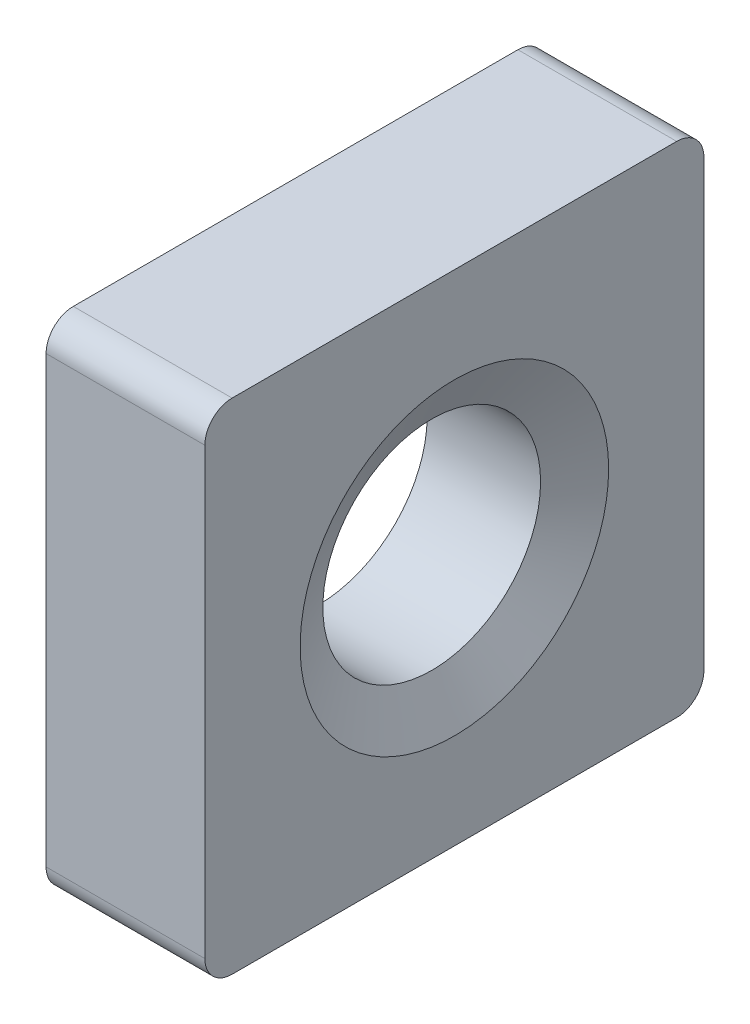
ISO-10303-21;
HEADER;
FILE_DESCRIPTION(('STEP AP214'),'2;1');
FILE_NAME('part.step','',(''),(''),'','','');
FILE_SCHEMA(('AUTOMOTIVE_DESIGN { 1 0 10303 214 1 1 1 1 }'));
ENDSEC;
DATA;
#1=APPLICATION_CONTEXT('core data for automotive mechanical design processes');
#2=APPLICATION_PROTOCOL_DEFINITION('international standard','automotive_design',2000,#1);
#3=PRODUCT_CONTEXT('',#1,'mechanical');
#4=PRODUCT('Part','Part','',(#3));
#5=PRODUCT_RELATED_PRODUCT_CATEGORY('part','',(#4));
#6=PRODUCT_DEFINITION_FORMATION('','',#4);
#7=PRODUCT_DEFINITION_CONTEXT('part definition',#1,'design');
#8=PRODUCT_DEFINITION('design','',#6,#7);
#9=PRODUCT_DEFINITION_SHAPE('','',#8);
#10=(LENGTH_UNIT() NAMED_UNIT(*) SI_UNIT(.MILLI.,.METRE.));
#11=(NAMED_UNIT(*) PLANE_ANGLE_UNIT() SI_UNIT($,.RADIAN.));
#12=(NAMED_UNIT(*) SI_UNIT($,.STERADIAN.) SOLID_ANGLE_UNIT());
#13=UNCERTAINTY_MEASURE_WITH_UNIT(LENGTH_MEASURE(1.E-05),#10,'distance_accuracy_value','');
#14=(GEOMETRIC_REPRESENTATION_CONTEXT(3) GLOBAL_UNCERTAINTY_ASSIGNED_CONTEXT((#13)) GLOBAL_UNIT_ASSIGNED_CONTEXT((#10,
#11,#12)) REPRESENTATION_CONTEXT('',''));
#15=CARTESIAN_POINT('',(0.,0.,0.));
#16=DIRECTION('',(0.,0.,1.));
#17=DIRECTION('',(1.,0.,0.));
#18=AXIS2_PLACEMENT_3D('',#15,#16,#17);
#19=CARTESIAN_POINT('',(1.75000000001546,57.2500008940697,2.75));
#20=DIRECTION('',(1.,0.,0.));
#21=DIRECTION('',(0.,0.,-1.));
#22=AXIS2_PLACEMENT_3D('',#19,#20,#21);
#23=CONICAL_SURFACE('',#22,1.7000000000589,1.10714871779409);
#24=CARTESIAN_POINT('',(1.5,57.2500008940697,2.75));
#25=DIRECTION('',(1.,0.,0.));
#26=DIRECTION('',(0.,0.,-1.));
#27=AXIS2_PLACEMENT_3D('',#24,#25,#26);
#28=CIRCLE('',#27,1.2);
#29=CARTESIAN_POINT('',(1.5,57.2500008940697,1.55));
#30=VERTEX_POINT('',#29);
#31=EDGE_CURVE('E126',#30,#30,#28,.F.);
#32=ORIENTED_EDGE('',*,*,#31,.T.);
#33=EDGE_LOOP('',(#32));
#34=FACE_BOUND('',#33,.T.);
#35=CARTESIAN_POINT('',(1.75000000000002,57.2500008940697,2.75));
#36=DIRECTION('',(1.,0.,0.));
#37=DIRECTION('',(0.,0.,-1.));
#38=AXIS2_PLACEMENT_3D('',#35,#36,#37);
#39=CIRCLE('',#38,1.70000000002801);
#40=CARTESIAN_POINT('',(1.75000000000002,57.2500008940697,1.04999999997199));
#41=VERTEX_POINT('',#40);
#42=EDGE_CURVE('E142',#41,#41,#39,.F.);
#43=ORIENTED_EDGE('',*,*,#42,.F.);
#44=EDGE_LOOP('',(#43));
#45=FACE_BOUND('',#44,.T.);
#46=ADVANCED_FACE('F16',(#34,#45),#23,.F.);
#47=CARTESIAN_POINT('',(0.875,59.7000008940697,5.2));
#48=DIRECTION('',(-1.,0.,0.));
#49=DIRECTION('',(0.,-1.,0.));
#50=AXIS2_PLACEMENT_3D('',#47,#48,#49);
#51=CYLINDRICAL_SURFACE('',#50,0.3);
#52=CARTESIAN_POINT('',(1.75,59.7000008940697,5.2));
#53=DIRECTION('',(-1.,0.,0.));
#54=DIRECTION('',(0.,-1.,0.));
#55=AXIS2_PLACEMENT_3D('',#52,#53,#54);
#56=CIRCLE('',#55,0.3);
#57=CARTESIAN_POINT('',(1.75,60.0000008940697,5.2));
#58=VERTEX_POINT('',#57);
#59=CARTESIAN_POINT('',(1.75,59.7000008940697,5.5));
#60=VERTEX_POINT('',#59);
#61=EDGE_CURVE('E149',#58,#60,#56,.F.);
#62=ORIENTED_EDGE('',*,*,#61,.F.);
#63=DIRECTION('',(1.,0.,0.));
#64=VECTOR('',#63,1.);
#65=CARTESIAN_POINT('',(0.875,60.0000008940697,5.2));
#66=LINE('',#65,#64);
#67=CARTESIAN_POINT('',(0.,60.0000008940697,5.2));
#68=VERTEX_POINT('',#67);
#69=EDGE_CURVE('E82',#58,#68,#66,.F.);
#70=ORIENTED_EDGE('',*,*,#69,.T.);
#71=CARTESIAN_POINT('',(0.,59.7000008940697,5.2));
#72=DIRECTION('',(-1.,0.,0.));
#73=DIRECTION('',(0.,-1.,0.));
#74=AXIS2_PLACEMENT_3D('',#71,#72,#73);
#75=CIRCLE('',#74,0.3);
#76=CARTESIAN_POINT('',(0.,59.7000008940697,5.5));
#77=VERTEX_POINT('',#76);
#78=EDGE_CURVE('E19',#68,#77,#75,.F.);
#79=ORIENTED_EDGE('',*,*,#78,.T.);
#80=DIRECTION('',(-1.,0.,0.));
#81=VECTOR('',#80,1.);
#82=CARTESIAN_POINT('',(0.875,59.7000008940697,5.5));
#83=LINE('',#82,#81);
#84=EDGE_CURVE('E80',#77,#60,#83,.F.);
#85=ORIENTED_EDGE('',*,*,#84,.T.);
#86=EDGE_LOOP('',(#62,#70,#79,#85));
#87=FACE_BOUND('',#86,.T.);
#88=ADVANCED_FACE('F79',(#87),#51,.T.);
#89=CARTESIAN_POINT('',(0.875,54.8000008940697,5.2));
#90=DIRECTION('',(-1.,0.,0.));
#91=DIRECTION('',(0.,-1.,0.));
#92=AXIS2_PLACEMENT_3D('',#89,#90,#91);
#93=CYLINDRICAL_SURFACE('',#92,0.3);
#94=CARTESIAN_POINT('',(1.75,54.8000008940697,5.2));
#95=DIRECTION('',(-1.,0.,0.));
#96=DIRECTION('',(0.,-1.,0.));
#97=AXIS2_PLACEMENT_3D('',#94,#95,#96);
#98=CIRCLE('',#97,0.3);
#99=CARTESIAN_POINT('',(1.75,54.8000008940697,5.5));
#100=VERTEX_POINT('',#99);
#101=CARTESIAN_POINT('',(1.75,54.5000008940697,5.2));
#102=VERTEX_POINT('',#101);
#103=EDGE_CURVE('E147',#100,#102,#98,.F.);
#104=ORIENTED_EDGE('',*,*,#103,.F.);
#105=DIRECTION('',(-1.,0.,0.));
#106=VECTOR('',#105,1.);
#107=CARTESIAN_POINT('',(0.875,54.8000008940697,5.5));
#108=LINE('',#107,#106);
#109=CARTESIAN_POINT('',(0.,54.8000008940697,5.5));
#110=VERTEX_POINT('',#109);
#111=EDGE_CURVE('E118',#100,#110,#108,.T.);
#112=ORIENTED_EDGE('',*,*,#111,.T.);
#113=CARTESIAN_POINT('',(0.,54.8000008940697,5.2));
#114=DIRECTION('',(-1.,0.,0.));
#115=DIRECTION('',(0.,-1.,0.));
#116=AXIS2_PLACEMENT_3D('',#113,#114,#115);
#117=CIRCLE('',#116,0.3);
#118=CARTESIAN_POINT('',(0.,54.5000008940697,5.2));
#119=VERTEX_POINT('',#118);
#120=EDGE_CURVE('E84',#110,#119,#117,.F.);
#121=ORIENTED_EDGE('',*,*,#120,.T.);
#122=DIRECTION('',(-1.,0.,0.));
#123=VECTOR('',#122,1.);
#124=CARTESIAN_POINT('',(0.875,54.5000008940697,5.2));
#125=LINE('',#124,#123);
#126=EDGE_CURVE('E114',#119,#102,#125,.F.);
#127=ORIENTED_EDGE('',*,*,#126,.T.);
#128=EDGE_LOOP('',(#104,#112,#121,#127));
#129=FACE_BOUND('',#128,.T.);
#130=ADVANCED_FACE('F154',(#129),#93,.T.);
#131=CARTESIAN_POINT('',(0.875,54.8000008940697,0.300000000000001));
#132=DIRECTION('',(-1.,0.,0.));
#133=DIRECTION('',(0.,-1.,0.));
#134=AXIS2_PLACEMENT_3D('',#131,#132,#133);
#135=CYLINDRICAL_SURFACE('',#134,0.3);
#136=CARTESIAN_POINT('',(1.75,54.8000008940697,0.300000000000001));
#137=DIRECTION('',(-1.,0.,0.));
#138=DIRECTION('',(0.,-1.,0.));
#139=AXIS2_PLACEMENT_3D('',#136,#137,#138);
#140=CIRCLE('',#139,0.3);
#141=CARTESIAN_POINT('',(1.75,54.5000008940697,0.300000000000002));
#142=VERTEX_POINT('',#141);
#143=CARTESIAN_POINT('',(1.75,54.8000008940697,0.));
#144=VERTEX_POINT('',#143);
#145=EDGE_CURVE('E145',#142,#144,#140,.F.);
#146=ORIENTED_EDGE('',*,*,#145,.F.);
#147=DIRECTION('',(-1.,0.,0.));
#148=VECTOR('',#147,1.);
#149=CARTESIAN_POINT('',(0.875,54.5000008940697,0.300000000000002));
#150=LINE('',#149,#148);
#151=CARTESIAN_POINT('',(0.,54.5000008940697,0.300000000000002));
#152=VERTEX_POINT('',#151);
#153=EDGE_CURVE('E111',#142,#152,#150,.T.);
#154=ORIENTED_EDGE('',*,*,#153,.T.);
#155=CARTESIAN_POINT('',(0.,54.8000008940697,0.300000000000001));
#156=DIRECTION('',(-1.,0.,0.));
#157=DIRECTION('',(0.,-1.,0.));
#158=AXIS2_PLACEMENT_3D('',#155,#156,#157);
#159=CIRCLE('',#158,0.3);
#160=CARTESIAN_POINT('',(0.,54.8000008940697,0.));
#161=VERTEX_POINT('',#160);
#162=EDGE_CURVE('E151',#152,#161,#159,.F.);
#163=ORIENTED_EDGE('',*,*,#162,.T.);
#164=DIRECTION('',(1.,0.,0.));
#165=VECTOR('',#164,1.);
#166=CARTESIAN_POINT('',(0.875,54.8000008940697,0.));
#167=LINE('',#166,#165);
#168=EDGE_CURVE('E107',#161,#144,#167,.T.);
#169=ORIENTED_EDGE('',*,*,#168,.T.);
#170=EDGE_LOOP('',(#146,#154,#163,#169));
#171=FACE_BOUND('',#170,.T.);
#172=ADVANCED_FACE('F162',(#171),#135,.T.);
#173=CARTESIAN_POINT('',(1.75,57.2500008940697,2.75));
#174=DIRECTION('',(1.,0.,0.));
#175=DIRECTION('',(0.,1.,0.));
#176=AXIS2_PLACEMENT_3D('',#173,#174,#175);
#177=PLANE('',#176);
#178=ORIENTED_EDGE('',*,*,#42,.T.);
#179=EDGE_LOOP('',(#178));
#180=FACE_BOUND('',#179,.T.);
#181=ORIENTED_EDGE('',*,*,#145,.T.);
#182=DIRECTION('',(0.,1.,0.));
#183=VECTOR('',#182,1.);
#184=CARTESIAN_POINT('',(1.75,57.2500008940697,0.));
#185=LINE('',#184,#183);
#186=CARTESIAN_POINT('',(1.75,59.7000008940697,0.));
#187=VERTEX_POINT('',#186);
#188=EDGE_CURVE('E110',#144,#187,#185,.T.);
#189=ORIENTED_EDGE('',*,*,#188,.T.);
#190=CARTESIAN_POINT('',(1.75,59.7000008940697,0.300000000000001));
#191=DIRECTION('',(-1.,0.,0.));
#192=DIRECTION('',(0.,-1.,0.));
#193=AXIS2_PLACEMENT_3D('',#190,#191,#192);
#194=CIRCLE('',#193,0.3);
#195=CARTESIAN_POINT('',(1.75,60.0000008940697,0.300000000000001));
#196=VERTEX_POINT('',#195);
#197=EDGE_CURVE('E129',#196,#187,#194,.T.);
#198=ORIENTED_EDGE('',*,*,#197,.F.);
#199=DIRECTION('',(0.,0.,1.));
#200=VECTOR('',#199,1.);
#201=CARTESIAN_POINT('',(1.75,60.0000008940697,2.75));
#202=LINE('',#201,#200);
#203=EDGE_CURVE('E125',#196,#58,#202,.T.);
#204=ORIENTED_EDGE('',*,*,#203,.T.);
#205=ORIENTED_EDGE('',*,*,#61,.T.);
#206=DIRECTION('',(0.,1.,0.));
#207=VECTOR('',#206,1.);
#208=CARTESIAN_POINT('',(1.75,57.2500008940697,5.5));
#209=LINE('',#208,#207);
#210=EDGE_CURVE('E92',#60,#100,#209,.F.);
#211=ORIENTED_EDGE('',*,*,#210,.T.);
#212=ORIENTED_EDGE('',*,*,#103,.T.);
#213=DIRECTION('',(0.,0.,1.));
#214=VECTOR('',#213,1.);
#215=CARTESIAN_POINT('',(1.75,54.5000008940697,2.75));
#216=LINE('',#215,#214);
#217=EDGE_CURVE('E117',#102,#142,#216,.F.);
#218=ORIENTED_EDGE('',*,*,#217,.T.);
#219=EDGE_LOOP('',(#181,#189,#198,#204,#205,#211,#212,#218));
#220=FACE_BOUND('',#219,.T.);
#221=ADVANCED_FACE('F164',(#180,#220),#177,.T.);
#222=CARTESIAN_POINT('',(0.875,59.7000008940697,0.300000000000001));
#223=DIRECTION('',(-1.,0.,0.));
#224=DIRECTION('',(0.,-1.,0.));
#225=AXIS2_PLACEMENT_3D('',#222,#223,#224);
#226=CYLINDRICAL_SURFACE('',#225,0.3);
#227=ORIENTED_EDGE('',*,*,#197,.T.);
#228=DIRECTION('',(1.,0.,0.));
#229=VECTOR('',#228,1.);
#230=CARTESIAN_POINT('',(0.875,59.7000008940697,0.));
#231=LINE('',#230,#229);
#232=CARTESIAN_POINT('',(0.,59.7000008940697,0.));
#233=VERTEX_POINT('',#232);
#234=EDGE_CURVE('E112',#187,#233,#231,.F.);
#235=ORIENTED_EDGE('',*,*,#234,.T.);
#236=CARTESIAN_POINT('',(0.,59.7000008940697,0.300000000000001));
#237=DIRECTION('',(-1.,0.,0.));
#238=DIRECTION('',(0.,-1.,0.));
#239=AXIS2_PLACEMENT_3D('',#236,#237,#238);
#240=CIRCLE('',#239,0.3);
#241=CARTESIAN_POINT('',(0.,60.0000008940697,0.300000000000001));
#242=VERTEX_POINT('',#241);
#243=EDGE_CURVE('E34',#233,#242,#240,.F.);
#244=ORIENTED_EDGE('',*,*,#243,.T.);
#245=DIRECTION('',(1.,0.,0.));
#246=VECTOR('',#245,1.);
#247=CARTESIAN_POINT('',(0.875,60.0000008940697,0.300000000000001));
#248=LINE('',#247,#246);
#249=EDGE_CURVE('E93',#242,#196,#248,.T.);
#250=ORIENTED_EDGE('',*,*,#249,.T.);
#251=EDGE_LOOP('',(#227,#235,#244,#250));
#252=FACE_BOUND('',#251,.T.);
#253=ADVANCED_FACE('F172',(#252),#226,.T.);
#254=CARTESIAN_POINT('',(1.,57.2500008940697,2.75));
#255=DIRECTION('',(1.,0.,0.));
#256=DIRECTION('',(0.,0.,-1.));
#257=AXIS2_PLACEMENT_3D('',#254,#255,#256);
#258=CYLINDRICAL_SURFACE('',#257,1.2);
#259=ORIENTED_EDGE('',*,*,#31,.F.);
#260=EDGE_LOOP('',(#259));
#261=FACE_BOUND('',#260,.T.);
#262=CARTESIAN_POINT('',(0.25000000002251,57.2500008940697,2.75));
#263=DIRECTION('',(-1.,0.,0.));
#264=DIRECTION('',(0.,-1.,0.));
#265=AXIS2_PLACEMENT_3D('',#262,#263,#264);
#266=CIRCLE('',#265,1.1999999999521);
#267=CARTESIAN_POINT('',(0.25000000002251,56.0500008941176,2.75));
#268=VERTEX_POINT('',#267);
#269=EDGE_CURVE('E103',#268,#268,#266,.T.);
#270=ORIENTED_EDGE('',*,*,#269,.T.);
#271=EDGE_LOOP('',(#270));
#272=FACE_BOUND('',#271,.T.);
#273=ADVANCED_FACE('F230',(#261,#272),#258,.F.);
#274=CARTESIAN_POINT('',(0.875,60.0000008940697,2.75));
#275=DIRECTION('',(0.,-1.,0.));
#276=DIRECTION('',(1.,0.,0.));
#277=AXIS2_PLACEMENT_3D('',#274,#275,#276);
#278=PLANE('',#277);
#279=DIRECTION('',(0.,0.,1.));
#280=VECTOR('',#279,1.);
#281=CARTESIAN_POINT('',(0.,60.0000008940697,2.75));
#282=LINE('',#281,#280);
#283=EDGE_CURVE('E99',#242,#68,#282,.T.);
#284=ORIENTED_EDGE('',*,*,#283,.T.);
#285=ORIENTED_EDGE('',*,*,#69,.F.);
#286=ORIENTED_EDGE('',*,*,#203,.F.);
#287=ORIENTED_EDGE('',*,*,#249,.F.);
#288=EDGE_LOOP('',(#284,#285,#286,#287));
#289=FACE_BOUND('',#288,.T.);
#290=ADVANCED_FACE('F169',(#289),#278,.F.);
#291=CARTESIAN_POINT('',(0.875,57.2500008940697,5.5));
#292=DIRECTION('',(0.,0.,-1.));
#293=DIRECTION('',(-1.,0.,0.));
#294=AXIS2_PLACEMENT_3D('',#291,#292,#293);
#295=PLANE('',#294);
#296=ORIENTED_EDGE('',*,*,#210,.F.);
#297=ORIENTED_EDGE('',*,*,#84,.F.);
#298=DIRECTION('',(0.,1.,0.));
#299=VECTOR('',#298,1.);
#300=CARTESIAN_POINT('',(0.,57.2500008940697,5.5));
#301=LINE('',#300,#299);
#302=EDGE_CURVE('E90',#77,#110,#301,.F.);
#303=ORIENTED_EDGE('',*,*,#302,.T.);
#304=ORIENTED_EDGE('',*,*,#111,.F.);
#305=EDGE_LOOP('',(#296,#297,#303,#304));
#306=FACE_BOUND('',#305,.T.);
#307=ADVANCED_FACE('F88',(#306),#295,.F.);
#308=CARTESIAN_POINT('',(0.875,54.5000008940697,2.75));
#309=DIRECTION('',(0.,1.,0.));
#310=DIRECTION('',(-1.,0.,0.));
#311=AXIS2_PLACEMENT_3D('',#308,#309,#310);
#312=PLANE('',#311);
#313=ORIENTED_EDGE('',*,*,#217,.F.);
#314=ORIENTED_EDGE('',*,*,#126,.F.);
#315=DIRECTION('',(0.,0.,1.));
#316=VECTOR('',#315,1.);
#317=CARTESIAN_POINT('',(0.,54.5000008940697,2.75));
#318=LINE('',#317,#316);
#319=EDGE_CURVE('E98',#119,#152,#318,.F.);
#320=ORIENTED_EDGE('',*,*,#319,.T.);
#321=ORIENTED_EDGE('',*,*,#153,.F.);
#322=EDGE_LOOP('',(#313,#314,#320,#321));
#323=FACE_BOUND('',#322,.T.);
#324=ADVANCED_FACE('F157',(#323),#312,.F.);
#325=CARTESIAN_POINT('',(0.875,57.2500008940697,0.));
#326=DIRECTION('',(0.,0.,1.));
#327=DIRECTION('',(1.,0.,0.));
#328=AXIS2_PLACEMENT_3D('',#325,#326,#327);
#329=PLANE('',#328);
#330=ORIENTED_EDGE('',*,*,#188,.F.);
#331=ORIENTED_EDGE('',*,*,#168,.F.);
#332=DIRECTION('',(0.,1.,0.));
#333=VECTOR('',#332,1.);
#334=CARTESIAN_POINT('',(0.,57.2500008940697,0.));
#335=LINE('',#334,#333);
#336=EDGE_CURVE('E25',#161,#233,#335,.T.);
#337=ORIENTED_EDGE('',*,*,#336,.T.);
#338=ORIENTED_EDGE('',*,*,#234,.F.);
#339=EDGE_LOOP('',(#330,#331,#337,#338));
#340=FACE_BOUND('',#339,.T.);
#341=ADVANCED_FACE('F175',(#340),#329,.F.);
#342=CARTESIAN_POINT('',(0.,57.2500008940697,2.75));
#343=DIRECTION('',(-1.,0.,0.));
#344=DIRECTION('',(0.,-1.,0.));
#345=AXIS2_PLACEMENT_3D('',#342,#343,#344);
#346=CONICAL_SURFACE('',#345,1.69999999999712,1.10714871779409);
#347=ORIENTED_EDGE('',*,*,#269,.F.);
#348=EDGE_LOOP('',(#347));
#349=FACE_BOUND('',#348,.T.);
#350=CARTESIAN_POINT('',(-1.54459778300975E-11,57.2500008940697,2.75));
#351=DIRECTION('',(-1.,0.,0.));
#352=DIRECTION('',(0.,-1.,0.));
#353=AXIS2_PLACEMENT_3D('',#350,#351,#352);
#354=CIRCLE('',#353,1.70000000002801);
#355=CARTESIAN_POINT('',(-1.54459778300975E-11,55.5500008940417,2.75));
#356=VERTEX_POINT('',#355);
#357=EDGE_CURVE('E11',#356,#356,#354,.T.);
#358=ORIENTED_EDGE('',*,*,#357,.T.);
#359=EDGE_LOOP('',(#358));
#360=FACE_BOUND('',#359,.T.);
#361=ADVANCED_FACE('F177',(#349,#360),#346,.F.);
#362=CARTESIAN_POINT('',(0.,57.2500008940697,2.75));
#363=DIRECTION('',(1.,0.,0.));
#364=DIRECTION('',(0.,1.,0.));
#365=AXIS2_PLACEMENT_3D('',#362,#363,#364);
#366=PLANE('',#365);
#367=ORIENTED_EDGE('',*,*,#357,.F.);
#368=EDGE_LOOP('',(#367));
#369=FACE_BOUND('',#368,.T.);
#370=ORIENTED_EDGE('',*,*,#336,.F.);
#371=ORIENTED_EDGE('',*,*,#162,.F.);
#372=ORIENTED_EDGE('',*,*,#319,.F.);
#373=ORIENTED_EDGE('',*,*,#120,.F.);
#374=ORIENTED_EDGE('',*,*,#302,.F.);
#375=ORIENTED_EDGE('',*,*,#78,.F.);
#376=ORIENTED_EDGE('',*,*,#283,.F.);
#377=ORIENTED_EDGE('',*,*,#243,.F.);
#378=EDGE_LOOP('',(#370,#371,#372,#373,#374,#375,#376,#377));
#379=FACE_BOUND('',#378,.T.);
#380=ADVANCED_FACE('F95',(#369,#379),#366,.F.);
#381=CLOSED_SHELL('',(#46,#88,#130,#172,#221,#253,#273,#290,#307,#324,#341,#361,#380));
#382=MANIFOLD_SOLID_BREP('B1',#381);
#383=ADVANCED_BREP_SHAPE_REPRESENTATION('',(#18,#382),#14);
#384=SHAPE_DEFINITION_REPRESENTATION(#9,#383);
ENDSEC;
END-ISO-10303-21;
